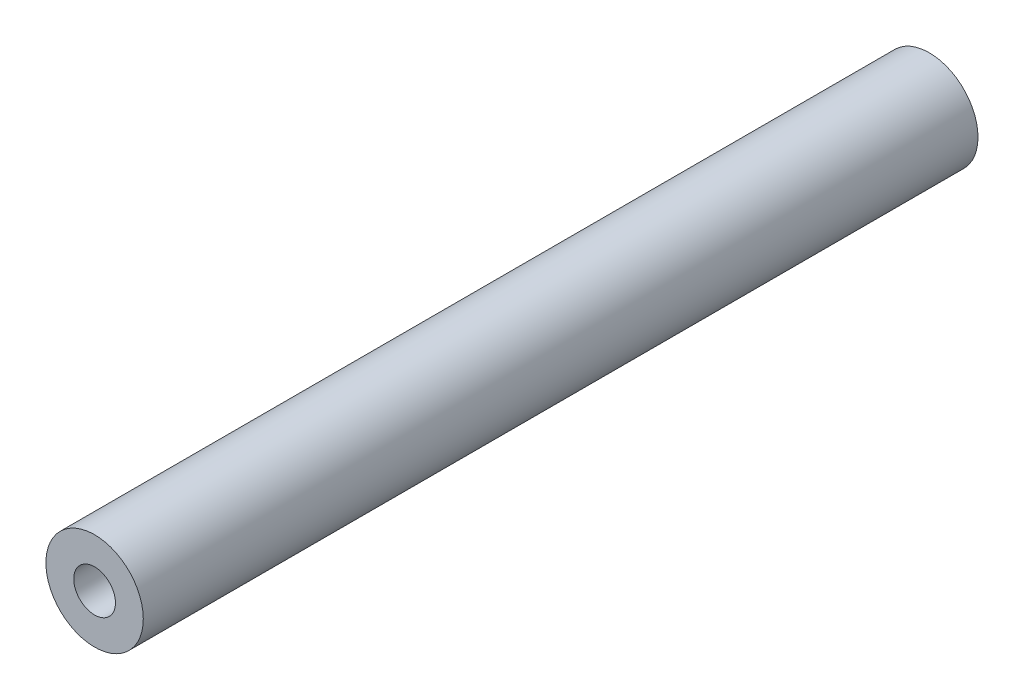
ISO-10303-21;
HEADER;
FILE_DESCRIPTION(('STEP AP214'),'2;1');
FILE_NAME('part.step','',(''),(''),'','','');
FILE_SCHEMA(('AUTOMOTIVE_DESIGN { 1 0 10303 214 1 1 1 1 }'));
ENDSEC;
DATA;
#1=APPLICATION_CONTEXT('core data for automotive mechanical design processes');
#2=APPLICATION_PROTOCOL_DEFINITION('international standard','automotive_design',2000,#1);
#3=PRODUCT_CONTEXT('',#1,'mechanical');
#4=PRODUCT('Part','Part','',(#3));
#5=PRODUCT_RELATED_PRODUCT_CATEGORY('part','',(#4));
#6=PRODUCT_DEFINITION_FORMATION('','',#4);
#7=PRODUCT_DEFINITION_CONTEXT('part definition',#1,'design');
#8=PRODUCT_DEFINITION('design','',#6,#7);
#9=PRODUCT_DEFINITION_SHAPE('','',#8);
#10=(LENGTH_UNIT() NAMED_UNIT(*) SI_UNIT(.MILLI.,.METRE.));
#11=(NAMED_UNIT(*) PLANE_ANGLE_UNIT() SI_UNIT($,.RADIAN.));
#12=(NAMED_UNIT(*) SI_UNIT($,.STERADIAN.) SOLID_ANGLE_UNIT());
#13=UNCERTAINTY_MEASURE_WITH_UNIT(LENGTH_MEASURE(1.E-05),#10,'distance_accuracy_value','');
#14=(GEOMETRIC_REPRESENTATION_CONTEXT(3) GLOBAL_UNCERTAINTY_ASSIGNED_CONTEXT((#13)) GLOBAL_UNIT_ASSIGNED_CONTEXT((#10,
#11,#12)) REPRESENTATION_CONTEXT('',''));
#15=CARTESIAN_POINT('',(0.,0.,0.));
#16=DIRECTION('',(0.,0.,1.));
#17=DIRECTION('',(1.,0.,0.));
#18=AXIS2_PLACEMENT_3D('',#15,#16,#17);
#19=CARTESIAN_POINT('',(0.,0.,60.));
#20=DIRECTION('',(0.,0.,-1.));
#21=DIRECTION('',(-1.,0.,0.));
#22=AXIS2_PLACEMENT_3D('',#19,#20,#21);
#23=CYLINDRICAL_SURFACE('',#22,3.);
#24=CARTESIAN_POINT('',(0.,0.,60.));
#25=DIRECTION('',(0.,0.,1.));
#26=DIRECTION('',(1.,0.,0.));
#27=AXIS2_PLACEMENT_3D('',#24,#25,#26);
#28=CIRCLE('',#27,3.);
#29=CARTESIAN_POINT('',(3.,0.,60.));
#30=VERTEX_POINT('',#29);
#31=EDGE_CURVE('E46',#30,#30,#28,.T.);
#32=ORIENTED_EDGE('',*,*,#31,.T.);
#33=EDGE_LOOP('',(#32));
#34=FACE_BOUND('',#33,.T.);
#35=CARTESIAN_POINT('',(0.,0.,-60.));
#36=DIRECTION('',(0.,0.,1.));
#37=DIRECTION('',(1.,0.,0.));
#38=AXIS2_PLACEMENT_3D('',#35,#36,#37);
#39=CIRCLE('',#38,3.);
#40=CARTESIAN_POINT('',(3.,0.,-60.));
#41=VERTEX_POINT('',#40);
#42=EDGE_CURVE('E55',#41,#41,#39,.T.);
#43=ORIENTED_EDGE('',*,*,#42,.F.);
#44=EDGE_LOOP('',(#43));
#45=FACE_BOUND('',#44,.T.);
#46=ADVANCED_FACE('F39',(#34,#45),#23,.F.);
#47=CARTESIAN_POINT('',(0.,0.,60.));
#48=DIRECTION('',(0.,0.,-1.));
#49=DIRECTION('',(-1.,0.,0.));
#50=AXIS2_PLACEMENT_3D('',#47,#48,#49);
#51=CYLINDRICAL_SURFACE('',#50,7.);
#52=CARTESIAN_POINT('',(0.,0.,60.));
#53=DIRECTION('',(0.,0.,1.));
#54=DIRECTION('',(1.,0.,0.));
#55=AXIS2_PLACEMENT_3D('',#52,#53,#54);
#56=CIRCLE('',#55,7.);
#57=CARTESIAN_POINT('',(7.,0.,60.));
#58=VERTEX_POINT('',#57);
#59=EDGE_CURVE('E10',#58,#58,#56,.T.);
#60=ORIENTED_EDGE('',*,*,#59,.F.);
#61=EDGE_LOOP('',(#60));
#62=FACE_BOUND('',#61,.T.);
#63=CARTESIAN_POINT('',(0.,0.,-60.));
#64=DIRECTION('',(0.,0.,1.));
#65=DIRECTION('',(1.,0.,0.));
#66=AXIS2_PLACEMENT_3D('',#63,#64,#65);
#67=CIRCLE('',#66,7.);
#68=CARTESIAN_POINT('',(7.,0.,-60.));
#69=VERTEX_POINT('',#68);
#70=EDGE_CURVE('E45',#69,#69,#67,.T.);
#71=ORIENTED_EDGE('',*,*,#70,.T.);
#72=EDGE_LOOP('',(#71));
#73=FACE_BOUND('',#72,.T.);
#74=ADVANCED_FACE('F56',(#62,#73),#51,.T.);
#75=CARTESIAN_POINT('',(0.,0.,60.));
#76=DIRECTION('',(0.,0.,1.));
#77=DIRECTION('',(1.,0.,0.));
#78=AXIS2_PLACEMENT_3D('',#75,#76,#77);
#79=PLANE('',#78);
#80=ORIENTED_EDGE('',*,*,#31,.F.);
#81=EDGE_LOOP('',(#80));
#82=FACE_BOUND('',#81,.T.);
#83=ORIENTED_EDGE('',*,*,#59,.T.);
#84=EDGE_LOOP('',(#83));
#85=FACE_BOUND('',#84,.T.);
#86=ADVANCED_FACE('F64',(#82,#85),#79,.T.);
#87=CARTESIAN_POINT('',(0.,0.,-60.));
#88=DIRECTION('',(0.,0.,1.));
#89=DIRECTION('',(1.,0.,0.));
#90=AXIS2_PLACEMENT_3D('',#87,#88,#89);
#91=PLANE('',#90);
#92=ORIENTED_EDGE('',*,*,#42,.T.);
#93=EDGE_LOOP('',(#92));
#94=FACE_BOUND('',#93,.T.);
#95=ORIENTED_EDGE('',*,*,#70,.F.);
#96=EDGE_LOOP('',(#95));
#97=FACE_BOUND('',#96,.T.);
#98=ADVANCED_FACE('F61',(#94,#97),#91,.F.);
#99=CLOSED_SHELL('',(#46,#74,#86,#98));
#100=MANIFOLD_SOLID_BREP('B2',#99);
#101=ADVANCED_BREP_SHAPE_REPRESENTATION('',(#18,#100),#14);
#102=SHAPE_DEFINITION_REPRESENTATION(#9,#101);
ENDSEC;
END-ISO-10303-21;
